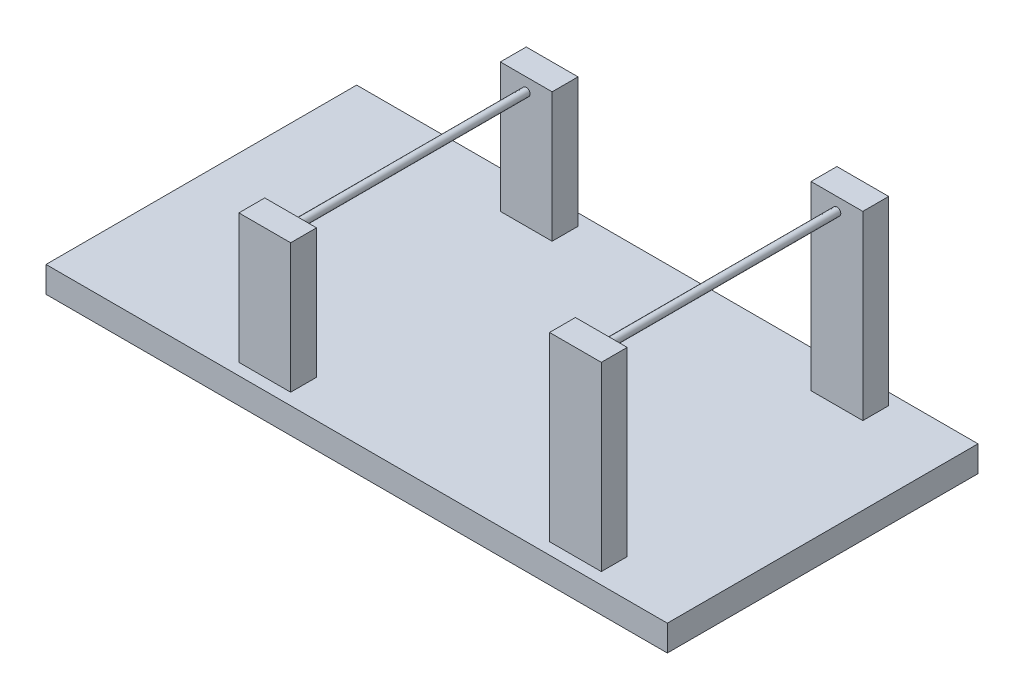
ISO-10303-21;
HEADER;
FILE_DESCRIPTION(('STEP AP214'),'2;1');
FILE_NAME('part.step','',(''),(''),'','','');
FILE_SCHEMA(('AUTOMOTIVE_DESIGN { 1 0 10303 214 1 1 1 1 }'));
ENDSEC;
DATA;
#1=APPLICATION_CONTEXT('core data for automotive mechanical design processes');
#2=APPLICATION_PROTOCOL_DEFINITION('international standard','automotive_design',2000,#1);
#3=PRODUCT_CONTEXT('',#1,'mechanical');
#4=PRODUCT('Part','Part','',(#3));
#5=PRODUCT_RELATED_PRODUCT_CATEGORY('part','',(#4));
#6=PRODUCT_DEFINITION_FORMATION('','',#4);
#7=PRODUCT_DEFINITION_CONTEXT('part definition',#1,'design');
#8=PRODUCT_DEFINITION('design','',#6,#7);
#9=PRODUCT_DEFINITION_SHAPE('','',#8);
#10=(LENGTH_UNIT() NAMED_UNIT(*) SI_UNIT(.MILLI.,.METRE.));
#11=(NAMED_UNIT(*) PLANE_ANGLE_UNIT() SI_UNIT($,.RADIAN.));
#12=(NAMED_UNIT(*) SI_UNIT($,.STERADIAN.) SOLID_ANGLE_UNIT());
#13=UNCERTAINTY_MEASURE_WITH_UNIT(LENGTH_MEASURE(1.E-05),#10,'distance_accuracy_value','');
#14=(GEOMETRIC_REPRESENTATION_CONTEXT(3) GLOBAL_UNCERTAINTY_ASSIGNED_CONTEXT((#13)) GLOBAL_UNIT_ASSIGNED_CONTEXT((#10,
#11,#12)) REPRESENTATION_CONTEXT('',''));
#15=CARTESIAN_POINT('',(0.,0.,0.));
#16=DIRECTION('',(0.,0.,1.));
#17=DIRECTION('',(1.,0.,0.));
#18=AXIS2_PLACEMENT_3D('',#15,#16,#17);
#19=CARTESIAN_POINT('',(0.,10.,0.));
#20=DIRECTION('',(0.,-1.,0.));
#21=DIRECTION('',(0.,0.,-1.));
#22=AXIS2_PLACEMENT_3D('',#19,#20,#21);
#23=PLANE('',#22);
#24=DIRECTION('',(0.,0.,1.));
#25=VECTOR('',#24,1.);
#26=CARTESIAN_POINT('',(70.,10.,0.));
#27=LINE('',#26,#25);
#28=CARTESIAN_POINT('',(70.,10.,45.5));
#29=VERTEX_POINT('',#28);
#30=CARTESIAN_POINT('',(70.,10.,55.5));
#31=VERTEX_POINT('',#30);
#32=EDGE_CURVE('E214',#29,#31,#27,.T.);
#33=ORIENTED_EDGE('',*,*,#32,.F.);
#34=DIRECTION('',(1.,0.,0.));
#35=VECTOR('',#34,1.);
#36=CARTESIAN_POINT('',(0.,10.,45.5));
#37=LINE('',#36,#35);
#38=CARTESIAN_POINT('',(90.,10.,45.5));
#39=VERTEX_POINT('',#38);
#40=EDGE_CURVE('E186',#29,#39,#37,.T.);
#41=ORIENTED_EDGE('',*,*,#40,.T.);
#42=DIRECTION('',(0.,0.,1.));
#43=VECTOR('',#42,1.);
#44=CARTESIAN_POINT('',(90.,10.,0.));
#45=LINE('',#44,#43);
#46=CARTESIAN_POINT('',(90.,10.,55.5));
#47=VERTEX_POINT('',#46);
#48=EDGE_CURVE('E202',#39,#47,#45,.T.);
#49=ORIENTED_EDGE('',*,*,#48,.T.);
#50=DIRECTION('',(1.,0.,0.));
#51=VECTOR('',#50,1.);
#52=CARTESIAN_POINT('',(0.,10.,55.5));
#53=LINE('',#52,#51);
#54=EDGE_CURVE('E55',#31,#47,#53,.T.);
#55=ORIENTED_EDGE('',*,*,#54,.F.);
#56=EDGE_LOOP('',(#33,#41,#49,#55));
#57=FACE_BOUND('',#56,.T.);
#58=DIRECTION('',(0.,0.,1.));
#59=VECTOR('',#58,1.);
#60=CARTESIAN_POINT('',(-50.,10.,45.5));
#61=LINE('',#60,#59);
#62=CARTESIAN_POINT('',(-50.,10.,45.5));
#63=VERTEX_POINT('',#62);
#64=CARTESIAN_POINT('',(-50.,10.,55.5));
#65=VERTEX_POINT('',#64);
#66=EDGE_CURVE('E269',#63,#65,#61,.T.);
#67=ORIENTED_EDGE('',*,*,#66,.F.);
#68=DIRECTION('',(1.,0.,0.));
#69=VECTOR('',#68,1.);
#70=CARTESIAN_POINT('',(-50.,10.,45.5));
#71=LINE('',#70,#69);
#72=CARTESIAN_POINT('',(-30.,10.,45.5));
#73=VERTEX_POINT('',#72);
#74=EDGE_CURVE('E259',#63,#73,#71,.T.);
#75=ORIENTED_EDGE('',*,*,#74,.T.);
#76=DIRECTION('',(0.,0.,1.));
#77=VECTOR('',#76,1.);
#78=CARTESIAN_POINT('',(-30.,10.,45.5));
#79=LINE('',#78,#77);
#80=CARTESIAN_POINT('',(-30.,10.,55.5));
#81=VERTEX_POINT('',#80);
#82=EDGE_CURVE('E262',#73,#81,#79,.T.);
#83=ORIENTED_EDGE('',*,*,#82,.T.);
#84=DIRECTION('',(1.,0.,0.));
#85=VECTOR('',#84,1.);
#86=CARTESIAN_POINT('',(-50.,10.,55.5));
#87=LINE('',#86,#85);
#88=EDGE_CURVE('E266',#65,#81,#87,.T.);
#89=ORIENTED_EDGE('',*,*,#88,.F.);
#90=EDGE_LOOP('',(#67,#75,#83,#89));
#91=FACE_BOUND('',#90,.T.);
#92=DIRECTION('',(0.,0.,-1.));
#93=VECTOR('',#92,1.);
#94=CARTESIAN_POINT('',(-50.,10.,-45.5));
#95=LINE('',#94,#93);
#96=CARTESIAN_POINT('',(-50.,10.,-45.5));
#97=VERTEX_POINT('',#96);
#98=CARTESIAN_POINT('',(-50.,10.,-55.5));
#99=VERTEX_POINT('',#98);
#100=EDGE_CURVE('E286',#97,#99,#95,.T.);
#101=ORIENTED_EDGE('',*,*,#100,.T.);
#102=DIRECTION('',(1.,0.,0.));
#103=VECTOR('',#102,1.);
#104=CARTESIAN_POINT('',(-50.,10.,-55.5));
#105=LINE('',#104,#103);
#106=CARTESIAN_POINT('',(-30.,10.,-55.5));
#107=VERTEX_POINT('',#106);
#108=EDGE_CURVE('E272',#99,#107,#105,.T.);
#109=ORIENTED_EDGE('',*,*,#108,.T.);
#110=DIRECTION('',(0.,0.,-1.));
#111=VECTOR('',#110,1.);
#112=CARTESIAN_POINT('',(-30.,10.,-45.5));
#113=LINE('',#112,#111);
#114=CARTESIAN_POINT('',(-30.,10.,-45.5));
#115=VERTEX_POINT('',#114);
#116=EDGE_CURVE('E295',#115,#107,#113,.T.);
#117=ORIENTED_EDGE('',*,*,#116,.F.);
#118=DIRECTION('',(1.,0.,0.));
#119=VECTOR('',#118,1.);
#120=CARTESIAN_POINT('',(-50.,10.,-45.5));
#121=LINE('',#120,#119);
#122=EDGE_CURVE('E298',#97,#115,#121,.T.);
#123=ORIENTED_EDGE('',*,*,#122,.F.);
#124=EDGE_LOOP('',(#101,#109,#117,#123));
#125=FACE_BOUND('',#124,.T.);
#126=DIRECTION('',(0.,0.,-1.));
#127=VECTOR('',#126,1.);
#128=CARTESIAN_POINT('',(120.,10.,60.));
#129=LINE('',#128,#127);
#130=CARTESIAN_POINT('',(120.,10.,60.));
#131=VERTEX_POINT('',#130);
#132=CARTESIAN_POINT('',(120.,10.,-60.));
#133=VERTEX_POINT('',#132);
#134=EDGE_CURVE('E314',#131,#133,#129,.T.);
#135=ORIENTED_EDGE('',*,*,#134,.T.);
#136=DIRECTION('',(-1.,0.,0.));
#137=VECTOR('',#136,1.);
#138=CARTESIAN_POINT('',(-120.,10.,-60.));
#139=LINE('',#138,#137);
#140=CARTESIAN_POINT('',(-120.,10.,-60.));
#141=VERTEX_POINT('',#140);
#142=EDGE_CURVE('E317',#133,#141,#139,.T.);
#143=ORIENTED_EDGE('',*,*,#142,.T.);
#144=DIRECTION('',(0.,0.,1.));
#145=VECTOR('',#144,1.);
#146=CARTESIAN_POINT('',(-120.,10.,60.));
#147=LINE('',#146,#145);
#148=CARTESIAN_POINT('',(-120.,10.,60.));
#149=VERTEX_POINT('',#148);
#150=EDGE_CURVE('E320',#141,#149,#147,.T.);
#151=ORIENTED_EDGE('',*,*,#150,.T.);
#152=DIRECTION('',(1.,0.,0.));
#153=VECTOR('',#152,1.);
#154=CARTESIAN_POINT('',(-120.,10.,60.));
#155=LINE('',#154,#153);
#156=EDGE_CURVE('E322',#149,#131,#155,.T.);
#157=ORIENTED_EDGE('',*,*,#156,.T.);
#158=EDGE_LOOP('',(#135,#143,#151,#157));
#159=FACE_BOUND('',#158,.T.);
#160=DIRECTION('',(1.,0.,0.));
#161=VECTOR('',#160,1.);
#162=CARTESIAN_POINT('',(0.,10.,-45.5));
#163=LINE('',#162,#161);
#164=CARTESIAN_POINT('',(70.,10.,-45.5));
#165=VERTEX_POINT('',#164);
#166=CARTESIAN_POINT('',(90.,10.,-45.5));
#167=VERTEX_POINT('',#166);
#168=EDGE_CURVE('E189',#165,#167,#163,.T.);
#169=ORIENTED_EDGE('',*,*,#168,.F.);
#170=DIRECTION('',(0.,0.,-1.));
#171=VECTOR('',#170,1.);
#172=CARTESIAN_POINT('',(70.,10.,0.));
#173=LINE('',#172,#171);
#174=CARTESIAN_POINT('',(70.,10.,-55.5));
#175=VERTEX_POINT('',#174);
#176=EDGE_CURVE('E225',#165,#175,#173,.T.);
#177=ORIENTED_EDGE('',*,*,#176,.T.);
#178=DIRECTION('',(1.,0.,0.));
#179=VECTOR('',#178,1.);
#180=CARTESIAN_POINT('',(0.,10.,-55.5));
#181=LINE('',#180,#179);
#182=CARTESIAN_POINT('',(90.,10.,-55.5));
#183=VERTEX_POINT('',#182);
#184=EDGE_CURVE('E63',#175,#183,#181,.T.);
#185=ORIENTED_EDGE('',*,*,#184,.T.);
#186=DIRECTION('',(0.,0.,-1.));
#187=VECTOR('',#186,1.);
#188=CARTESIAN_POINT('',(90.,10.,0.));
#189=LINE('',#188,#187);
#190=EDGE_CURVE('E236',#167,#183,#189,.T.);
#191=ORIENTED_EDGE('',*,*,#190,.F.);
#192=EDGE_LOOP('',(#169,#177,#185,#191));
#193=FACE_BOUND('',#192,.T.);
#194=ADVANCED_FACE('F39',(#57,#91,#125,#159,#193),#23,.F.);
#195=CARTESIAN_POINT('',(120.,10.,60.));
#196=DIRECTION('',(-1.,0.,0.));
#197=DIRECTION('',(0.,0.,1.));
#198=AXIS2_PLACEMENT_3D('',#195,#196,#197);
#199=PLANE('',#198);
#200=DIRECTION('',(0.,0.,-1.));
#201=VECTOR('',#200,1.);
#202=CARTESIAN_POINT('',(120.,0.,60.));
#203=LINE('',#202,#201);
#204=CARTESIAN_POINT('',(120.,0.,60.));
#205=VERTEX_POINT('',#204);
#206=CARTESIAN_POINT('',(120.,0.,-60.));
#207=VERTEX_POINT('',#206);
#208=EDGE_CURVE('E305',#205,#207,#203,.T.);
#209=ORIENTED_EDGE('',*,*,#208,.T.);
#210=DIRECTION('',(0.,-1.,0.));
#211=VECTOR('',#210,1.);
#212=CARTESIAN_POINT('',(120.,10.,-60.));
#213=LINE('',#212,#211);
#214=EDGE_CURVE('E339',#133,#207,#213,.T.);
#215=ORIENTED_EDGE('',*,*,#214,.F.);
#216=ORIENTED_EDGE('',*,*,#134,.F.);
#217=DIRECTION('',(0.,-1.,0.));
#218=VECTOR('',#217,1.);
#219=CARTESIAN_POINT('',(120.,10.,60.));
#220=LINE('',#219,#218);
#221=EDGE_CURVE('E324',#131,#205,#220,.T.);
#222=ORIENTED_EDGE('',*,*,#221,.T.);
#223=EDGE_LOOP('',(#209,#215,#216,#222));
#224=FACE_BOUND('',#223,.T.);
#225=ADVANCED_FACE('F41',(#224),#199,.F.);
#226=CARTESIAN_POINT('',(-120.,10.,-60.));
#227=DIRECTION('',(0.,0.,1.));
#228=DIRECTION('',(1.,0.,0.));
#229=AXIS2_PLACEMENT_3D('',#226,#227,#228);
#230=PLANE('',#229);
#231=DIRECTION('',(-1.,0.,0.));
#232=VECTOR('',#231,1.);
#233=CARTESIAN_POINT('',(-120.,0.,-60.));
#234=LINE('',#233,#232);
#235=CARTESIAN_POINT('',(-120.,0.,-60.));
#236=VERTEX_POINT('',#235);
#237=EDGE_CURVE('E327',#207,#236,#234,.T.);
#238=ORIENTED_EDGE('',*,*,#237,.T.);
#239=DIRECTION('',(0.,-1.,0.));
#240=VECTOR('',#239,1.);
#241=CARTESIAN_POINT('',(-120.,10.,-60.));
#242=LINE('',#241,#240);
#243=EDGE_CURVE('E337',#141,#236,#242,.T.);
#244=ORIENTED_EDGE('',*,*,#243,.F.);
#245=ORIENTED_EDGE('',*,*,#142,.F.);
#246=ORIENTED_EDGE('',*,*,#214,.T.);
#247=EDGE_LOOP('',(#238,#244,#245,#246));
#248=FACE_BOUND('',#247,.T.);
#249=ADVANCED_FACE('F389',(#248),#230,.F.);
#250=CARTESIAN_POINT('',(-120.,10.,60.));
#251=DIRECTION('',(1.,0.,0.));
#252=DIRECTION('',(0.,0.,-1.));
#253=AXIS2_PLACEMENT_3D('',#250,#251,#252);
#254=PLANE('',#253);
#255=DIRECTION('',(0.,0.,1.));
#256=VECTOR('',#255,1.);
#257=CARTESIAN_POINT('',(-120.,0.,60.));
#258=LINE('',#257,#256);
#259=CARTESIAN_POINT('',(-120.,0.,60.));
#260=VERTEX_POINT('',#259);
#261=EDGE_CURVE('E329',#236,#260,#258,.T.);
#262=ORIENTED_EDGE('',*,*,#261,.T.);
#263=DIRECTION('',(0.,-1.,0.));
#264=VECTOR('',#263,1.);
#265=CARTESIAN_POINT('',(-120.,10.,60.));
#266=LINE('',#265,#264);
#267=EDGE_CURVE('E334',#149,#260,#266,.T.);
#268=ORIENTED_EDGE('',*,*,#267,.F.);
#269=ORIENTED_EDGE('',*,*,#150,.F.);
#270=ORIENTED_EDGE('',*,*,#243,.T.);
#271=EDGE_LOOP('',(#262,#268,#269,#270));
#272=FACE_BOUND('',#271,.T.);
#273=ADVANCED_FACE('F402',(#272),#254,.F.);
#274=CARTESIAN_POINT('',(-120.,10.,60.));
#275=DIRECTION('',(0.,0.,-1.));
#276=DIRECTION('',(-1.,0.,0.));
#277=AXIS2_PLACEMENT_3D('',#274,#275,#276);
#278=PLANE('',#277);
#279=DIRECTION('',(1.,0.,0.));
#280=VECTOR('',#279,1.);
#281=CARTESIAN_POINT('',(-120.,0.,60.));
#282=LINE('',#281,#280);
#283=EDGE_CURVE('E318',#260,#205,#282,.T.);
#284=ORIENTED_EDGE('',*,*,#283,.T.);
#285=ORIENTED_EDGE('',*,*,#221,.F.);
#286=ORIENTED_EDGE('',*,*,#156,.F.);
#287=ORIENTED_EDGE('',*,*,#267,.T.);
#288=EDGE_LOOP('',(#284,#285,#286,#287));
#289=FACE_BOUND('',#288,.T.);
#290=ADVANCED_FACE('F398',(#289),#278,.F.);
#291=CARTESIAN_POINT('',(0.,0.,0.));
#292=DIRECTION('',(0.,-1.,0.));
#293=DIRECTION('',(0.,0.,-1.));
#294=AXIS2_PLACEMENT_3D('',#291,#292,#293);
#295=PLANE('',#294);
#296=ORIENTED_EDGE('',*,*,#208,.F.);
#297=ORIENTED_EDGE('',*,*,#283,.F.);
#298=ORIENTED_EDGE('',*,*,#261,.F.);
#299=ORIENTED_EDGE('',*,*,#237,.F.);
#300=EDGE_LOOP('',(#296,#297,#298,#299));
#301=FACE_BOUND('',#300,.T.);
#302=ADVANCED_FACE('F395',(#301),#295,.T.);
#303=CARTESIAN_POINT('',(-50.,60.,-55.5));
#304=DIRECTION('',(0.,0.,-1.));
#305=DIRECTION('',(-1.,0.,0.));
#306=AXIS2_PLACEMENT_3D('',#303,#304,#305);
#307=PLANE('',#306);
#308=ORIENTED_EDGE('',*,*,#108,.F.);
#309=DIRECTION('',(0.,-1.,0.));
#310=VECTOR('',#309,1.);
#311=CARTESIAN_POINT('',(-50.,60.,-55.5));
#312=LINE('',#311,#310);
#313=CARTESIAN_POINT('',(-50.,60.,-55.5));
#314=VERTEX_POINT('',#313);
#315=EDGE_CURVE('E302',#314,#99,#312,.T.);
#316=ORIENTED_EDGE('',*,*,#315,.F.);
#317=DIRECTION('',(1.,0.,0.));
#318=VECTOR('',#317,1.);
#319=CARTESIAN_POINT('',(-50.,60.,-55.5));
#320=LINE('',#319,#318);
#321=CARTESIAN_POINT('',(-30.,60.,-55.5));
#322=VERTEX_POINT('',#321);
#323=EDGE_CURVE('E282',#314,#322,#320,.T.);
#324=ORIENTED_EDGE('',*,*,#323,.T.);
#325=DIRECTION('',(0.,-1.,0.));
#326=VECTOR('',#325,1.);
#327=CARTESIAN_POINT('',(-30.,60.,-55.5));
#328=LINE('',#327,#326);
#329=EDGE_CURVE('E293',#322,#107,#328,.T.);
#330=ORIENTED_EDGE('',*,*,#329,.T.);
#331=EDGE_LOOP('',(#308,#316,#324,#330));
#332=FACE_BOUND('',#331,.T.);
#333=ADVANCED_FACE('F393',(#332),#307,.T.);
#334=CARTESIAN_POINT('',(-50.,60.,-45.5));
#335=DIRECTION('',(-1.,0.,0.));
#336=DIRECTION('',(0.,0.,1.));
#337=AXIS2_PLACEMENT_3D('',#334,#335,#336);
#338=PLANE('',#337);
#339=ORIENTED_EDGE('',*,*,#100,.F.);
#340=DIRECTION('',(0.,-1.,0.));
#341=VECTOR('',#340,1.);
#342=CARTESIAN_POINT('',(-50.,60.,-45.5));
#343=LINE('',#342,#341);
#344=CARTESIAN_POINT('',(-50.,60.,-45.5));
#345=VERTEX_POINT('',#344);
#346=EDGE_CURVE('E306',#345,#97,#343,.T.);
#347=ORIENTED_EDGE('',*,*,#346,.F.);
#348=DIRECTION('',(0.,0.,-1.));
#349=VECTOR('',#348,1.);
#350=CARTESIAN_POINT('',(-50.,60.,-45.5));
#351=LINE('',#350,#349);
#352=EDGE_CURVE('E290',#345,#314,#351,.T.);
#353=ORIENTED_EDGE('',*,*,#352,.T.);
#354=ORIENTED_EDGE('',*,*,#315,.T.);
#355=EDGE_LOOP('',(#339,#347,#353,#354));
#356=FACE_BOUND('',#355,.T.);
#357=ADVANCED_FACE('F482',(#356),#338,.T.);
#358=CARTESIAN_POINT('',(-50.,60.,-45.5));
#359=DIRECTION('',(0.,0.,-1.));
#360=DIRECTION('',(-1.,0.,0.));
#361=AXIS2_PLACEMENT_3D('',#358,#359,#360);
#362=PLANE('',#361);
#363=CARTESIAN_POINT('',(-40.,55.,-45.5));
#364=DIRECTION('',(0.,0.,-1.));
#365=DIRECTION('',(-1.,0.,0.));
#366=AXIS2_PLACEMENT_3D('',#363,#364,#365);
#367=CIRCLE('',#366,1.5);
#368=CARTESIAN_POINT('',(-38.5,55.,-45.5));
#369=VERTEX_POINT('',#368);
#370=EDGE_CURVE('E207',#369,#369,#367,.T.);
#371=ORIENTED_EDGE('',*,*,#370,.T.);
#372=EDGE_LOOP('',(#371));
#373=FACE_BOUND('',#372,.T.);
#374=ORIENTED_EDGE('',*,*,#122,.T.);
#375=DIRECTION('',(0.,-1.,0.));
#376=VECTOR('',#375,1.);
#377=CARTESIAN_POINT('',(-30.,60.,-45.5));
#378=LINE('',#377,#376);
#379=CARTESIAN_POINT('',(-30.,60.,-45.5));
#380=VERTEX_POINT('',#379);
#381=EDGE_CURVE('E309',#380,#115,#378,.T.);
#382=ORIENTED_EDGE('',*,*,#381,.F.);
#383=DIRECTION('',(1.,0.,0.));
#384=VECTOR('',#383,1.);
#385=CARTESIAN_POINT('',(-50.,60.,-45.5));
#386=LINE('',#385,#384);
#387=EDGE_CURVE('E288',#345,#380,#386,.T.);
#388=ORIENTED_EDGE('',*,*,#387,.F.);
#389=ORIENTED_EDGE('',*,*,#346,.T.);
#390=EDGE_LOOP('',(#374,#382,#388,#389));
#391=FACE_BOUND('',#390,.T.);
#392=ADVANCED_FACE('F479',(#373,#391),#362,.F.);
#393=CARTESIAN_POINT('',(-30.,60.,-45.5));
#394=DIRECTION('',(-1.,0.,0.));
#395=DIRECTION('',(0.,0.,1.));
#396=AXIS2_PLACEMENT_3D('',#393,#394,#395);
#397=PLANE('',#396);
#398=ORIENTED_EDGE('',*,*,#116,.T.);
#399=ORIENTED_EDGE('',*,*,#329,.F.);
#400=DIRECTION('',(0.,0.,-1.));
#401=VECTOR('',#400,1.);
#402=CARTESIAN_POINT('',(-30.,60.,-45.5));
#403=LINE('',#402,#401);
#404=EDGE_CURVE('E285',#380,#322,#403,.T.);
#405=ORIENTED_EDGE('',*,*,#404,.F.);
#406=ORIENTED_EDGE('',*,*,#381,.T.);
#407=EDGE_LOOP('',(#398,#399,#405,#406));
#408=FACE_BOUND('',#407,.T.);
#409=ADVANCED_FACE('F481',(#408),#397,.F.);
#410=CARTESIAN_POINT('',(0.,60.,0.));
#411=DIRECTION('',(0.,1.,0.));
#412=DIRECTION('',(0.,0.,1.));
#413=AXIS2_PLACEMENT_3D('',#410,#411,#412);
#414=PLANE('',#413);
#415=ORIENTED_EDGE('',*,*,#323,.F.);
#416=ORIENTED_EDGE('',*,*,#352,.F.);
#417=ORIENTED_EDGE('',*,*,#387,.T.);
#418=ORIENTED_EDGE('',*,*,#404,.T.);
#419=EDGE_LOOP('',(#415,#416,#417,#418));
#420=FACE_BOUND('',#419,.T.);
#421=ADVANCED_FACE('F379',(#420),#414,.T.);
#422=CARTESIAN_POINT('',(-50.,60.,45.5));
#423=DIRECTION('',(1.,0.,0.));
#424=DIRECTION('',(0.,0.,-1.));
#425=AXIS2_PLACEMENT_3D('',#422,#423,#424);
#426=PLANE('',#425);
#427=ORIENTED_EDGE('',*,*,#66,.T.);
#428=DIRECTION('',(0.,-1.,0.));
#429=VECTOR('',#428,1.);
#430=CARTESIAN_POINT('',(-50.,60.,55.5));
#431=LINE('',#430,#429);
#432=CARTESIAN_POINT('',(-50.,60.,55.5));
#433=VERTEX_POINT('',#432);
#434=EDGE_CURVE('E249',#433,#65,#431,.T.);
#435=ORIENTED_EDGE('',*,*,#434,.F.);
#436=DIRECTION('',(0.,0.,1.));
#437=VECTOR('',#436,1.);
#438=CARTESIAN_POINT('',(-50.,60.,45.5));
#439=LINE('',#438,#437);
#440=CARTESIAN_POINT('',(-50.,60.,45.5));
#441=VERTEX_POINT('',#440);
#442=EDGE_CURVE('E263',#441,#433,#439,.T.);
#443=ORIENTED_EDGE('',*,*,#442,.F.);
#444=DIRECTION('',(0.,-1.,0.));
#445=VECTOR('',#444,1.);
#446=CARTESIAN_POINT('',(-50.,60.,45.5));
#447=LINE('',#446,#445);
#448=EDGE_CURVE('E256',#441,#63,#447,.T.);
#449=ORIENTED_EDGE('',*,*,#448,.T.);
#450=EDGE_LOOP('',(#427,#435,#443,#449));
#451=FACE_BOUND('',#450,.T.);
#452=ADVANCED_FACE('F363',(#451),#426,.F.);
#453=CARTESIAN_POINT('',(-50.,60.,55.5));
#454=DIRECTION('',(0.,0.,-1.));
#455=DIRECTION('',(-1.,0.,0.));
#456=AXIS2_PLACEMENT_3D('',#453,#454,#455);
#457=PLANE('',#456);
#458=ORIENTED_EDGE('',*,*,#88,.T.);
#459=DIRECTION('',(0.,-1.,0.));
#460=VECTOR('',#459,1.);
#461=CARTESIAN_POINT('',(-30.,60.,55.5));
#462=LINE('',#461,#460);
#463=CARTESIAN_POINT('',(-30.,60.,55.5));
#464=VERTEX_POINT('',#463);
#465=EDGE_CURVE('E251',#464,#81,#462,.T.);
#466=ORIENTED_EDGE('',*,*,#465,.F.);
#467=DIRECTION('',(1.,0.,0.));
#468=VECTOR('',#467,1.);
#469=CARTESIAN_POINT('',(-50.,60.,55.5));
#470=LINE('',#469,#468);
#471=EDGE_CURVE('E278',#433,#464,#470,.T.);
#472=ORIENTED_EDGE('',*,*,#471,.F.);
#473=ORIENTED_EDGE('',*,*,#434,.T.);
#474=EDGE_LOOP('',(#458,#466,#472,#473));
#475=FACE_BOUND('',#474,.T.);
#476=ADVANCED_FACE('F370',(#475),#457,.F.);
#477=CARTESIAN_POINT('',(-30.,60.,45.5));
#478=DIRECTION('',(1.,0.,0.));
#479=DIRECTION('',(0.,0.,-1.));
#480=AXIS2_PLACEMENT_3D('',#477,#478,#479);
#481=PLANE('',#480);
#482=ORIENTED_EDGE('',*,*,#82,.F.);
#483=DIRECTION('',(0.,-1.,0.));
#484=VECTOR('',#483,1.);
#485=CARTESIAN_POINT('',(-30.,60.,45.5));
#486=LINE('',#485,#484);
#487=CARTESIAN_POINT('',(-30.,60.,45.5));
#488=VERTEX_POINT('',#487);
#489=EDGE_CURVE('E253',#488,#73,#486,.T.);
#490=ORIENTED_EDGE('',*,*,#489,.F.);
#491=DIRECTION('',(0.,0.,1.));
#492=VECTOR('',#491,1.);
#493=CARTESIAN_POINT('',(-30.,60.,45.5));
#494=LINE('',#493,#492);
#495=EDGE_CURVE('E275',#488,#464,#494,.T.);
#496=ORIENTED_EDGE('',*,*,#495,.T.);
#497=ORIENTED_EDGE('',*,*,#465,.T.);
#498=EDGE_LOOP('',(#482,#490,#496,#497));
#499=FACE_BOUND('',#498,.T.);
#500=ADVANCED_FACE('F353',(#499),#481,.T.);
#501=CARTESIAN_POINT('',(-50.,60.,45.5));
#502=DIRECTION('',(0.,0.,-1.));
#503=DIRECTION('',(-1.,0.,0.));
#504=AXIS2_PLACEMENT_3D('',#501,#502,#503);
#505=PLANE('',#504);
#506=CARTESIAN_POINT('',(-40.,55.,45.5));
#507=DIRECTION('',(0.,0.,-1.));
#508=DIRECTION('',(-1.,0.,0.));
#509=AXIS2_PLACEMENT_3D('',#506,#507,#508);
#510=CIRCLE('',#509,1.5);
#511=CARTESIAN_POINT('',(-38.5,55.,45.5));
#512=VERTEX_POINT('',#511);
#513=EDGE_CURVE('E43',#512,#512,#510,.T.);
#514=ORIENTED_EDGE('',*,*,#513,.F.);
#515=EDGE_LOOP('',(#514));
#516=FACE_BOUND('',#515,.T.);
#517=ORIENTED_EDGE('',*,*,#74,.F.);
#518=ORIENTED_EDGE('',*,*,#448,.F.);
#519=DIRECTION('',(1.,0.,0.));
#520=VECTOR('',#519,1.);
#521=CARTESIAN_POINT('',(-50.,60.,45.5));
#522=LINE('',#521,#520);
#523=EDGE_CURVE('E258',#441,#488,#522,.T.);
#524=ORIENTED_EDGE('',*,*,#523,.T.);
#525=ORIENTED_EDGE('',*,*,#489,.T.);
#526=EDGE_LOOP('',(#517,#518,#524,#525));
#527=FACE_BOUND('',#526,.T.);
#528=ADVANCED_FACE('F349',(#516,#527),#505,.T.);
#529=CARTESIAN_POINT('',(0.,60.,0.));
#530=DIRECTION('',(0.,1.,0.));
#531=DIRECTION('',(0.,0.,1.));
#532=AXIS2_PLACEMENT_3D('',#529,#530,#531);
#533=PLANE('',#532);
#534=ORIENTED_EDGE('',*,*,#442,.T.);
#535=ORIENTED_EDGE('',*,*,#471,.T.);
#536=ORIENTED_EDGE('',*,*,#495,.F.);
#537=ORIENTED_EDGE('',*,*,#523,.F.);
#538=EDGE_LOOP('',(#534,#535,#536,#537));
#539=FACE_BOUND('',#538,.T.);
#540=ADVANCED_FACE('F352',(#539),#533,.T.);
#541=CARTESIAN_POINT('',(0.,80.,-45.5));
#542=DIRECTION('',(0.,0.,-1.));
#543=DIRECTION('',(-1.,0.,0.));
#544=AXIS2_PLACEMENT_3D('',#541,#542,#543);
#545=PLANE('',#544);
#546=CARTESIAN_POINT('',(80.,75.,-45.5));
#547=DIRECTION('',(0.,0.,-1.));
#548=DIRECTION('',(-1.,0.,0.));
#549=AXIS2_PLACEMENT_3D('',#546,#547,#548);
#550=CIRCLE('',#549,1.5);
#551=CARTESIAN_POINT('',(81.5,75.,-45.5));
#552=VERTEX_POINT('',#551);
#553=EDGE_CURVE('E475',#552,#552,#550,.T.);
#554=ORIENTED_EDGE('',*,*,#553,.T.);
#555=EDGE_LOOP('',(#554));
#556=FACE_BOUND('',#555,.T.);
#557=ORIENTED_EDGE('',*,*,#168,.T.);
#558=DIRECTION('',(0.,-1.,0.));
#559=VECTOR('',#558,1.);
#560=CARTESIAN_POINT('',(90.,80.,-45.5));
#561=LINE('',#560,#559);
#562=CARTESIAN_POINT('',(90.,80.,-45.5));
#563=VERTEX_POINT('',#562);
#564=EDGE_CURVE('E247',#563,#167,#561,.T.);
#565=ORIENTED_EDGE('',*,*,#564,.F.);
#566=DIRECTION('',(1.,0.,0.));
#567=VECTOR('',#566,1.);
#568=CARTESIAN_POINT('',(0.,80.,-45.5));
#569=LINE('',#568,#567);
#570=CARTESIAN_POINT('',(70.,80.,-45.5));
#571=VERTEX_POINT('',#570);
#572=EDGE_CURVE('E221',#571,#563,#569,.T.);
#573=ORIENTED_EDGE('',*,*,#572,.F.);
#574=DIRECTION('',(0.,-1.,0.));
#575=VECTOR('',#574,1.);
#576=CARTESIAN_POINT('',(70.,80.,-45.5));
#577=LINE('',#576,#575);
#578=EDGE_CURVE('E233',#571,#165,#577,.T.);
#579=ORIENTED_EDGE('',*,*,#578,.T.);
#580=EDGE_LOOP('',(#557,#565,#573,#579));
#581=FACE_BOUND('',#580,.T.);
#582=ADVANCED_FACE('F425',(#556,#581),#545,.F.);
#583=CARTESIAN_POINT('',(90.,80.,0.));
#584=DIRECTION('',(-1.,0.,0.));
#585=DIRECTION('',(0.,0.,1.));
#586=AXIS2_PLACEMENT_3D('',#583,#584,#585);
#587=PLANE('',#586);
#588=ORIENTED_EDGE('',*,*,#190,.T.);
#589=DIRECTION('',(0.,-1.,0.));
#590=VECTOR('',#589,1.);
#591=CARTESIAN_POINT('',(90.,80.,-55.5));
#592=LINE('',#591,#590);
#593=CARTESIAN_POINT('',(90.,80.,-55.5));
#594=VERTEX_POINT('',#593);
#595=EDGE_CURVE('E245',#594,#183,#592,.T.);
#596=ORIENTED_EDGE('',*,*,#595,.F.);
#597=DIRECTION('',(0.,0.,-1.));
#598=VECTOR('',#597,1.);
#599=CARTESIAN_POINT('',(90.,80.,0.));
#600=LINE('',#599,#598);
#601=EDGE_CURVE('E224',#563,#594,#600,.T.);
#602=ORIENTED_EDGE('',*,*,#601,.F.);
#603=ORIENTED_EDGE('',*,*,#564,.T.);
#604=EDGE_LOOP('',(#588,#596,#602,#603));
#605=FACE_BOUND('',#604,.T.);
#606=ADVANCED_FACE('F436',(#605),#587,.F.);
#607=CARTESIAN_POINT('',(0.,80.,-55.5));
#608=DIRECTION('',(0.,0.,-1.));
#609=DIRECTION('',(-1.,0.,0.));
#610=AXIS2_PLACEMENT_3D('',#607,#608,#609);
#611=PLANE('',#610);
#612=ORIENTED_EDGE('',*,*,#184,.F.);
#613=DIRECTION('',(0.,-1.,0.));
#614=VECTOR('',#613,1.);
#615=CARTESIAN_POINT('',(70.,80.,-55.5));
#616=LINE('',#615,#614);
#617=CARTESIAN_POINT('',(70.,80.,-55.5));
#618=VERTEX_POINT('',#617);
#619=EDGE_CURVE('E243',#618,#175,#616,.T.);
#620=ORIENTED_EDGE('',*,*,#619,.F.);
#621=DIRECTION('',(1.,0.,0.));
#622=VECTOR('',#621,1.);
#623=CARTESIAN_POINT('',(0.,80.,-55.5));
#624=LINE('',#623,#622);
#625=EDGE_CURVE('E227',#618,#594,#624,.T.);
#626=ORIENTED_EDGE('',*,*,#625,.T.);
#627=ORIENTED_EDGE('',*,*,#595,.T.);
#628=EDGE_LOOP('',(#612,#620,#626,#627));
#629=FACE_BOUND('',#628,.T.);
#630=ADVANCED_FACE('F431',(#629),#611,.T.);
#631=CARTESIAN_POINT('',(70.,80.,0.));
#632=DIRECTION('',(-1.,0.,0.));
#633=DIRECTION('',(0.,0.,1.));
#634=AXIS2_PLACEMENT_3D('',#631,#632,#633);
#635=PLANE('',#634);
#636=ORIENTED_EDGE('',*,*,#176,.F.);
#637=ORIENTED_EDGE('',*,*,#578,.F.);
#638=DIRECTION('',(0.,0.,-1.));
#639=VECTOR('',#638,1.);
#640=CARTESIAN_POINT('',(70.,80.,0.));
#641=LINE('',#640,#639);
#642=EDGE_CURVE('E230',#571,#618,#641,.T.);
#643=ORIENTED_EDGE('',*,*,#642,.T.);
#644=ORIENTED_EDGE('',*,*,#619,.T.);
#645=EDGE_LOOP('',(#636,#637,#643,#644));
#646=FACE_BOUND('',#645,.T.);
#647=ADVANCED_FACE('F429',(#646),#635,.T.);
#648=CARTESIAN_POINT('',(0.,80.,0.));
#649=DIRECTION('',(0.,1.,0.));
#650=DIRECTION('',(0.,0.,1.));
#651=AXIS2_PLACEMENT_3D('',#648,#649,#650);
#652=PLANE('',#651);
#653=ORIENTED_EDGE('',*,*,#572,.T.);
#654=ORIENTED_EDGE('',*,*,#601,.T.);
#655=ORIENTED_EDGE('',*,*,#625,.F.);
#656=ORIENTED_EDGE('',*,*,#642,.F.);
#657=EDGE_LOOP('',(#653,#654,#655,#656));
#658=FACE_BOUND('',#657,.T.);
#659=ADVANCED_FACE('F433',(#658),#652,.T.);
#660=CARTESIAN_POINT('',(0.,80.,45.5));
#661=DIRECTION('',(0.,0.,-1.));
#662=DIRECTION('',(-1.,0.,0.));
#663=AXIS2_PLACEMENT_3D('',#660,#661,#662);
#664=PLANE('',#663);
#665=CARTESIAN_POINT('',(80.,75.,45.5));
#666=DIRECTION('',(0.,0.,-1.));
#667=DIRECTION('',(-1.,0.,0.));
#668=AXIS2_PLACEMENT_3D('',#665,#666,#667);
#669=CIRCLE('',#668,1.5);
#670=CARTESIAN_POINT('',(81.5,75.,45.5));
#671=VERTEX_POINT('',#670);
#672=EDGE_CURVE('E11',#671,#671,#669,.T.);
#673=ORIENTED_EDGE('',*,*,#672,.F.);
#674=EDGE_LOOP('',(#673));
#675=FACE_BOUND('',#674,.T.);
#676=ORIENTED_EDGE('',*,*,#40,.F.);
#677=DIRECTION('',(0.,-1.,0.));
#678=VECTOR('',#677,1.);
#679=CARTESIAN_POINT('',(70.,80.,45.5));
#680=LINE('',#679,#678);
#681=CARTESIAN_POINT('',(70.,80.,45.5));
#682=VERTEX_POINT('',#681);
#683=EDGE_CURVE('E179',#682,#29,#680,.T.);
#684=ORIENTED_EDGE('',*,*,#683,.F.);
#685=DIRECTION('',(1.,0.,0.));
#686=VECTOR('',#685,1.);
#687=CARTESIAN_POINT('',(0.,80.,45.5));
#688=LINE('',#687,#686);
#689=CARTESIAN_POINT('',(90.,80.,45.5));
#690=VERTEX_POINT('',#689);
#691=EDGE_CURVE('E183',#682,#690,#688,.T.);
#692=ORIENTED_EDGE('',*,*,#691,.T.);
#693=DIRECTION('',(0.,-1.,0.));
#694=VECTOR('',#693,1.);
#695=CARTESIAN_POINT('',(90.,80.,45.5));
#696=LINE('',#695,#694);
#697=EDGE_CURVE('E212',#690,#39,#696,.T.);
#698=ORIENTED_EDGE('',*,*,#697,.T.);
#699=EDGE_LOOP('',(#676,#684,#692,#698));
#700=FACE_BOUND('',#699,.T.);
#701=ADVANCED_FACE('F181',(#675,#700),#664,.T.);
#702=CARTESIAN_POINT('',(70.,80.,0.));
#703=DIRECTION('',(1.,0.,0.));
#704=DIRECTION('',(0.,0.,-1.));
#705=AXIS2_PLACEMENT_3D('',#702,#703,#704);
#706=PLANE('',#705);
#707=ORIENTED_EDGE('',*,*,#32,.T.);
#708=DIRECTION('',(0.,-1.,0.));
#709=VECTOR('',#708,1.);
#710=CARTESIAN_POINT('',(70.,80.,55.5));
#711=LINE('',#710,#709);
#712=CARTESIAN_POINT('',(70.,80.,55.5));
#713=VERTEX_POINT('',#712);
#714=EDGE_CURVE('E190',#713,#31,#711,.T.);
#715=ORIENTED_EDGE('',*,*,#714,.F.);
#716=DIRECTION('',(0.,0.,1.));
#717=VECTOR('',#716,1.);
#718=CARTESIAN_POINT('',(70.,80.,0.));
#719=LINE('',#718,#717);
#720=EDGE_CURVE('E193',#682,#713,#719,.T.);
#721=ORIENTED_EDGE('',*,*,#720,.F.);
#722=ORIENTED_EDGE('',*,*,#683,.T.);
#723=EDGE_LOOP('',(#707,#715,#721,#722));
#724=FACE_BOUND('',#723,.T.);
#725=ADVANCED_FACE('F194',(#724),#706,.F.);
#726=CARTESIAN_POINT('',(0.,80.,55.5));
#727=DIRECTION('',(0.,0.,-1.));
#728=DIRECTION('',(-1.,0.,0.));
#729=AXIS2_PLACEMENT_3D('',#726,#727,#728);
#730=PLANE('',#729);
#731=ORIENTED_EDGE('',*,*,#54,.T.);
#732=DIRECTION('',(0.,-1.,0.));
#733=VECTOR('',#732,1.);
#734=CARTESIAN_POINT('',(90.,80.,55.5));
#735=LINE('',#734,#733);
#736=CARTESIAN_POINT('',(90.,80.,55.5));
#737=VERTEX_POINT('',#736);
#738=EDGE_CURVE('E218',#737,#47,#735,.T.);
#739=ORIENTED_EDGE('',*,*,#738,.F.);
#740=DIRECTION('',(1.,0.,0.));
#741=VECTOR('',#740,1.);
#742=CARTESIAN_POINT('',(0.,80.,55.5));
#743=LINE('',#742,#741);
#744=EDGE_CURVE('E197',#713,#737,#743,.T.);
#745=ORIENTED_EDGE('',*,*,#744,.F.);
#746=ORIENTED_EDGE('',*,*,#714,.T.);
#747=EDGE_LOOP('',(#731,#739,#745,#746));
#748=FACE_BOUND('',#747,.T.);
#749=ADVANCED_FACE('F455',(#748),#730,.F.);
#750=CARTESIAN_POINT('',(90.,80.,0.));
#751=DIRECTION('',(1.,0.,0.));
#752=DIRECTION('',(0.,0.,-1.));
#753=AXIS2_PLACEMENT_3D('',#750,#751,#752);
#754=PLANE('',#753);
#755=ORIENTED_EDGE('',*,*,#48,.F.);
#756=ORIENTED_EDGE('',*,*,#697,.F.);
#757=DIRECTION('',(0.,0.,1.));
#758=VECTOR('',#757,1.);
#759=CARTESIAN_POINT('',(90.,80.,0.));
#760=LINE('',#759,#758);
#761=EDGE_CURVE('E201',#690,#737,#760,.T.);
#762=ORIENTED_EDGE('',*,*,#761,.T.);
#763=ORIENTED_EDGE('',*,*,#738,.T.);
#764=EDGE_LOOP('',(#755,#756,#762,#763));
#765=FACE_BOUND('',#764,.T.);
#766=ADVANCED_FACE('F458',(#765),#754,.T.);
#767=CARTESIAN_POINT('',(0.,80.,0.));
#768=DIRECTION('',(0.,1.,0.));
#769=DIRECTION('',(0.,0.,1.));
#770=AXIS2_PLACEMENT_3D('',#767,#768,#769);
#771=PLANE('',#770);
#772=ORIENTED_EDGE('',*,*,#691,.F.);
#773=ORIENTED_EDGE('',*,*,#720,.T.);
#774=ORIENTED_EDGE('',*,*,#744,.T.);
#775=ORIENTED_EDGE('',*,*,#761,.F.);
#776=EDGE_LOOP('',(#772,#773,#774,#775));
#777=FACE_BOUND('',#776,.T.);
#778=ADVANCED_FACE('F199',(#777),#771,.T.);
#779=CARTESIAN_POINT('',(-40.,55.,-59.7426406871193));
#780=DIRECTION('',(0.,0.,1.));
#781=DIRECTION('',(1.,0.,0.));
#782=AXIS2_PLACEMENT_3D('',#779,#780,#781);
#783=CYLINDRICAL_SURFACE('',#782,1.5);
#784=CARTESIAN_POINT('',(-38.5,55.,45.5));
#785=CARTESIAN_POINT('',(-38.5,55.,44.5520833333333));
#786=CARTESIAN_POINT('',(-38.5,55.,43.6041666666667));
#787=CARTESIAN_POINT('',(-38.5,55.,41.7083333333333));
#788=CARTESIAN_POINT('',(-38.5,55.,40.7604166666667));
#789=CARTESIAN_POINT('',(-38.5,55.,38.8645833333334));
#790=CARTESIAN_POINT('',(-38.5,55.,37.9166666666667));
#791=CARTESIAN_POINT('',(-38.5,55.,36.0208333333333));
#792=CARTESIAN_POINT('',(-38.5,55.,35.0729166666667));
#793=CARTESIAN_POINT('',(-38.5,55.,33.1770833333334));
#794=CARTESIAN_POINT('',(-38.5,55.,32.2291666666667));
#795=CARTESIAN_POINT('',(-38.5,55.,30.3333333333333));
#796=CARTESIAN_POINT('',(-38.5,55.,29.3854166666667));
#797=CARTESIAN_POINT('',(-38.5,55.,27.4895833333333));
#798=CARTESIAN_POINT('',(-38.5,55.,26.5416666666667));
#799=CARTESIAN_POINT('',(-38.5,55.,24.6458333333333));
#800=CARTESIAN_POINT('',(-38.5,55.,23.6979166666667));
#801=CARTESIAN_POINT('',(-38.5,55.,21.8020833333333));
#802=CARTESIAN_POINT('',(-38.5,55.,20.8541666666667));
#803=CARTESIAN_POINT('',(-38.5,55.,18.9583333333333));
#804=CARTESIAN_POINT('',(-38.5,55.,18.0104166666667));
#805=CARTESIAN_POINT('',(-38.5,55.,16.1145833333333));
#806=CARTESIAN_POINT('',(-38.5,55.,15.1666666666667));
#807=CARTESIAN_POINT('',(-38.5,55.,13.2708333333333));
#808=CARTESIAN_POINT('',(-38.5,55.,12.3229166666667));
#809=CARTESIAN_POINT('',(-38.5,55.,10.4270833333333));
#810=CARTESIAN_POINT('',(-38.5,55.,9.47916666666667));
#811=CARTESIAN_POINT('',(-38.5,55.,7.58333333333334));
#812=CARTESIAN_POINT('',(-38.5,55.,6.63541666666667));
#813=CARTESIAN_POINT('',(-38.5,55.,4.73958333333334));
#814=CARTESIAN_POINT('',(-38.5,55.,3.79166666666668));
#815=CARTESIAN_POINT('',(-38.5,55.,1.89583333333335));
#816=CARTESIAN_POINT('',(-38.5,55.,0.94791666666668));
#817=CARTESIAN_POINT('',(-38.5,55.,-0.947916666666652));
#818=CARTESIAN_POINT('',(-38.5,55.,-1.89583333333332));
#819=CARTESIAN_POINT('',(-38.5,55.,-3.79166666666665));
#820=CARTESIAN_POINT('',(-38.5,55.,-4.73958333333332));
#821=CARTESIAN_POINT('',(-38.5,55.,-6.63541666666665));
#822=CARTESIAN_POINT('',(-38.5,55.,-7.58333333333332));
#823=CARTESIAN_POINT('',(-38.5,55.,-9.47916666666666));
#824=CARTESIAN_POINT('',(-38.5,55.,-10.4270833333333));
#825=CARTESIAN_POINT('',(-38.5,55.,-12.3229166666667));
#826=CARTESIAN_POINT('',(-38.5,55.,-13.2708333333333));
#827=CARTESIAN_POINT('',(-38.5,55.,-15.1666666666667));
#828=CARTESIAN_POINT('',(-38.5,55.,-16.1145833333333));
#829=CARTESIAN_POINT('',(-38.5,55.,-18.0104166666667));
#830=CARTESIAN_POINT('',(-38.5,55.,-18.9583333333333));
#831=CARTESIAN_POINT('',(-38.5,55.,-20.8541666666667));
#832=CARTESIAN_POINT('',(-38.5,55.,-21.8020833333333));
#833=CARTESIAN_POINT('',(-38.5,55.,-23.6979166666667));
#834=CARTESIAN_POINT('',(-38.5,55.,-24.6458333333333));
#835=CARTESIAN_POINT('',(-38.5,55.,-26.5416666666667));
#836=CARTESIAN_POINT('',(-38.5,55.,-27.4895833333333));
#837=CARTESIAN_POINT('',(-38.5,55.,-29.3854166666667));
#838=CARTESIAN_POINT('',(-38.5,55.,-30.3333333333333));
#839=CARTESIAN_POINT('',(-38.5,55.,-32.2291666666667));
#840=CARTESIAN_POINT('',(-38.5,55.,-33.1770833333333));
#841=CARTESIAN_POINT('',(-38.5,55.,-35.0729166666667));
#842=CARTESIAN_POINT('',(-38.5,55.,-36.0208333333333));
#843=CARTESIAN_POINT('',(-38.5,55.,-37.9166666666667));
#844=CARTESIAN_POINT('',(-38.5,55.,-38.8645833333333));
#845=CARTESIAN_POINT('',(-38.5,55.,-40.7604166666667));
#846=CARTESIAN_POINT('',(-38.5,55.,-41.7083333333333));
#847=CARTESIAN_POINT('',(-38.5,55.,-43.6041666666667));
#848=CARTESIAN_POINT('',(-38.5,55.,-44.5520833333333));
#849=CARTESIAN_POINT('',(-38.5,55.,-45.5));
#850=B_SPLINE_CURVE_WITH_KNOTS('',3,(#784,#785,#786,#787,#788,#789,#790,#791,#792,#793,#794,
#795,#796,#797,#798,#799,#800,#801,#802,#803,#804,#805,#806,#807,#808,#809,#810,#811,#812,#813,
#814,#815,#816,#817,#818,#819,#820,#821,#822,#823,#824,#825,#826,#827,#828,#829,#830,#831,#832,
#833,#834,#835,#836,#837,#838,#839,#840,#841,#842,#843,#844,#845,#846,#847,#848,#849),
.UNSPECIFIED.,.F.,.F.,(4,2,2,2,2,2,2,2,2,2,2,2,2,2,2,2,2,2,2,2,2,2,2,2,2,2,2,2,2,2,2,2,4),(0.,
2.84375000000001,5.6875,8.53125,11.375,14.21875,17.0625,19.90625,22.75,25.59375,28.4375,
31.28125,34.125,36.96875,39.8125,42.65625,45.5,48.34375,51.1875,54.03125,56.875,59.71875,
62.5625,65.40625,68.25,71.09375,73.9375,76.78125,79.625,82.46875,85.3125,88.15625,91.),.UNSPECIFIED.);
#851=EDGE_CURVE('BSEAM346',#512,#369,#850,.T.);
#852=ORIENTED_EDGE('',*,*,#513,.T.);
#853=ORIENTED_EDGE('',*,*,#370,.F.);
#854=ORIENTED_EDGE('',*,*,#851,.T.);
#855=ORIENTED_EDGE('',*,*,#851,.F.);
#856=EDGE_LOOP('',(#852,#854,#853,#855));
#857=FACE_BOUND('',#856,.T.);
#858=ADVANCED_FACE('F346',(#857),#783,.T.);
#859=CARTESIAN_POINT('',(80.,75.,-59.7426406871193));
#860=DIRECTION('',(0.,0.,1.));
#861=DIRECTION('',(1.,0.,0.));
#862=AXIS2_PLACEMENT_3D('',#859,#860,#861);
#863=CYLINDRICAL_SURFACE('',#862,1.5);
#864=CARTESIAN_POINT('',(81.5,75.,45.5));
#865=CARTESIAN_POINT('',(81.5,75.,44.5520833333333));
#866=CARTESIAN_POINT('',(81.5,75.,43.6041666666667));
#867=CARTESIAN_POINT('',(81.5,75.,41.7083333333333));
#868=CARTESIAN_POINT('',(81.5,75.,40.7604166666667));
#869=CARTESIAN_POINT('',(81.5,75.,38.8645833333334));
#870=CARTESIAN_POINT('',(81.5,75.,37.9166666666667));
#871=CARTESIAN_POINT('',(81.5,75.,36.0208333333333));
#872=CARTESIAN_POINT('',(81.5,75.,35.0729166666667));
#873=CARTESIAN_POINT('',(81.5,75.,33.1770833333334));
#874=CARTESIAN_POINT('',(81.5,75.,32.2291666666667));
#875=CARTESIAN_POINT('',(81.5,75.,30.3333333333333));
#876=CARTESIAN_POINT('',(81.5,75.,29.3854166666667));
#877=CARTESIAN_POINT('',(81.5,75.,27.4895833333333));
#878=CARTESIAN_POINT('',(81.5,75.,26.5416666666667));
#879=CARTESIAN_POINT('',(81.5,75.,24.6458333333333));
#880=CARTESIAN_POINT('',(81.5,75.,23.6979166666667));
#881=CARTESIAN_POINT('',(81.5,75.,21.8020833333333));
#882=CARTESIAN_POINT('',(81.5,75.,20.8541666666667));
#883=CARTESIAN_POINT('',(81.5,75.,18.9583333333333));
#884=CARTESIAN_POINT('',(81.5,75.,18.0104166666667));
#885=CARTESIAN_POINT('',(81.5,75.,16.1145833333333));
#886=CARTESIAN_POINT('',(81.5,75.,15.1666666666667));
#887=CARTESIAN_POINT('',(81.5,75.,13.2708333333333));
#888=CARTESIAN_POINT('',(81.5,75.,12.3229166666667));
#889=CARTESIAN_POINT('',(81.5,75.,10.4270833333333));
#890=CARTESIAN_POINT('',(81.5,75.,9.47916666666667));
#891=CARTESIAN_POINT('',(81.5,75.,7.58333333333334));
#892=CARTESIAN_POINT('',(81.5,75.,6.63541666666667));
#893=CARTESIAN_POINT('',(81.5,75.,4.73958333333334));
#894=CARTESIAN_POINT('',(81.5,75.,3.79166666666668));
#895=CARTESIAN_POINT('',(81.5,75.,1.89583333333335));
#896=CARTESIAN_POINT('',(81.5,75.,0.94791666666668));
#897=CARTESIAN_POINT('',(81.5,75.,-0.947916666666652));
#898=CARTESIAN_POINT('',(81.5,75.,-1.89583333333332));
#899=CARTESIAN_POINT('',(81.5,75.,-3.79166666666665));
#900=CARTESIAN_POINT('',(81.5,75.,-4.73958333333332));
#901=CARTESIAN_POINT('',(81.5,75.,-6.63541666666665));
#902=CARTESIAN_POINT('',(81.5,75.,-7.58333333333332));
#903=CARTESIAN_POINT('',(81.5,75.,-9.47916666666666));
#904=CARTESIAN_POINT('',(81.5,75.,-10.4270833333333));
#905=CARTESIAN_POINT('',(81.5,75.,-12.3229166666667));
#906=CARTESIAN_POINT('',(81.5,75.,-13.2708333333333));
#907=CARTESIAN_POINT('',(81.5,75.,-15.1666666666667));
#908=CARTESIAN_POINT('',(81.5,75.,-16.1145833333333));
#909=CARTESIAN_POINT('',(81.5,75.,-18.0104166666667));
#910=CARTESIAN_POINT('',(81.5,75.,-18.9583333333333));
#911=CARTESIAN_POINT('',(81.5,75.,-20.8541666666667));
#912=CARTESIAN_POINT('',(81.5,75.,-21.8020833333333));
#913=CARTESIAN_POINT('',(81.5,75.,-23.6979166666667));
#914=CARTESIAN_POINT('',(81.5,75.,-24.6458333333333));
#915=CARTESIAN_POINT('',(81.5,75.,-26.5416666666667));
#916=CARTESIAN_POINT('',(81.5,75.,-27.4895833333333));
#917=CARTESIAN_POINT('',(81.5,75.,-29.3854166666667));
#918=CARTESIAN_POINT('',(81.5,75.,-30.3333333333333));
#919=CARTESIAN_POINT('',(81.5,75.,-32.2291666666667));
#920=CARTESIAN_POINT('',(81.5,75.,-33.1770833333333));
#921=CARTESIAN_POINT('',(81.5,75.,-35.0729166666667));
#922=CARTESIAN_POINT('',(81.5,75.,-36.0208333333333));
#923=CARTESIAN_POINT('',(81.5,75.,-37.9166666666667));
#924=CARTESIAN_POINT('',(81.5,75.,-38.8645833333333));
#925=CARTESIAN_POINT('',(81.5,75.,-40.7604166666667));
#926=CARTESIAN_POINT('',(81.5,75.,-41.7083333333333));
#927=CARTESIAN_POINT('',(81.5,75.,-43.6041666666667));
#928=CARTESIAN_POINT('',(81.5,75.,-44.5520833333333));
#929=CARTESIAN_POINT('',(81.5,75.,-45.5));
#930=B_SPLINE_CURVE_WITH_KNOTS('',3,(#864,#865,#866,#867,#868,#869,#870,#871,#872,#873,#874,
#875,#876,#877,#878,#879,#880,#881,#882,#883,#884,#885,#886,#887,#888,#889,#890,#891,#892,#893,
#894,#895,#896,#897,#898,#899,#900,#901,#902,#903,#904,#905,#906,#907,#908,#909,#910,#911,#912,
#913,#914,#915,#916,#917,#918,#919,#920,#921,#922,#923,#924,#925,#926,#927,#928,#929),
.UNSPECIFIED.,.F.,.F.,(4,2,2,2,2,2,2,2,2,2,2,2,2,2,2,2,2,2,2,2,2,2,2,2,2,2,2,2,2,2,2,2,4),(0.,
2.84375000000001,5.6875,8.53125,11.375,14.21875,17.0625,19.90625,22.75,25.59375,28.4375,
31.28125,34.125,36.96875,39.8125,42.65625,45.5,48.34375,51.1875,54.03125,56.875,59.71875,
62.5625,65.40625,68.25,71.09375,73.9375,76.78125,79.625,82.46875,85.3125,88.15625,91.),.UNSPECIFIED.);
#931=EDGE_CURVE('BSEAM466',#671,#552,#930,.T.);
#932=ORIENTED_EDGE('',*,*,#672,.T.);
#933=ORIENTED_EDGE('',*,*,#553,.F.);
#934=ORIENTED_EDGE('',*,*,#931,.T.);
#935=ORIENTED_EDGE('',*,*,#931,.F.);
#936=EDGE_LOOP('',(#932,#934,#933,#935));
#937=FACE_BOUND('',#936,.T.);
#938=ADVANCED_FACE('F466',(#937),#863,.T.);
#939=CLOSED_SHELL('',(#194,#225,#249,#273,#290,#302,#333,#357,#392,#409,#421,#452,#476,#500,
#528,#540,#582,#606,#630,#647,#659,#701,#725,#749,#766,#778,#858,#938));
#940=MANIFOLD_SOLID_BREP('B2',#939);
#941=ADVANCED_BREP_SHAPE_REPRESENTATION('',(#18,#940),#14);
#942=SHAPE_DEFINITION_REPRESENTATION(#9,#941);
ENDSEC;
END-ISO-10303-21;
